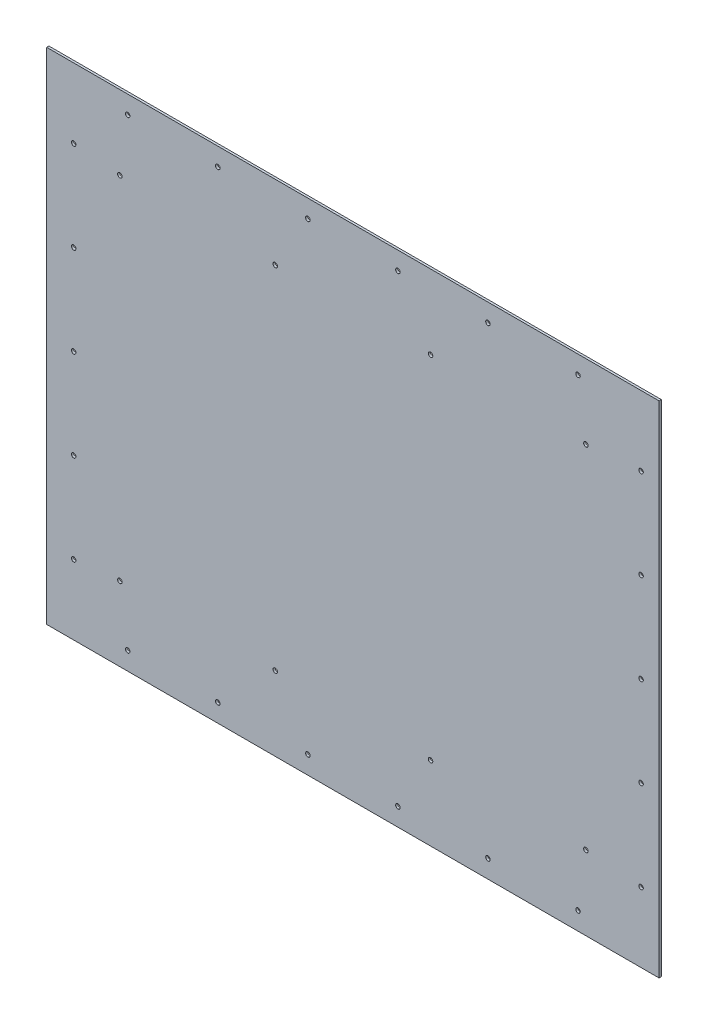
ISO-10303-21;
HEADER;
FILE_DESCRIPTION(('STEP AP214'),'2;1');
FILE_NAME('part.step','',(''),(''),'','','');
FILE_SCHEMA(('AUTOMOTIVE_DESIGN { 1 0 10303 214 1 1 1 1 }'));
ENDSEC;
DATA;
#1=APPLICATION_CONTEXT('core data for automotive mechanical design processes');
#2=APPLICATION_PROTOCOL_DEFINITION('international standard','automotive_design',2000,#1);
#3=PRODUCT_CONTEXT('',#1,'mechanical');
#4=PRODUCT('Part','Part','',(#3));
#5=PRODUCT_RELATED_PRODUCT_CATEGORY('part','',(#4));
#6=PRODUCT_DEFINITION_FORMATION('','',#4);
#7=PRODUCT_DEFINITION_CONTEXT('part definition',#1,'design');
#8=PRODUCT_DEFINITION('design','',#6,#7);
#9=PRODUCT_DEFINITION_SHAPE('','',#8);
#10=(LENGTH_UNIT() NAMED_UNIT(*) SI_UNIT(.MILLI.,.METRE.));
#11=(NAMED_UNIT(*) PLANE_ANGLE_UNIT() SI_UNIT($,.RADIAN.));
#12=(NAMED_UNIT(*) SI_UNIT($,.STERADIAN.) SOLID_ANGLE_UNIT());
#13=UNCERTAINTY_MEASURE_WITH_UNIT(LENGTH_MEASURE(1.E-05),#10,'distance_accuracy_value','');
#14=(GEOMETRIC_REPRESENTATION_CONTEXT(3) GLOBAL_UNCERTAINTY_ASSIGNED_CONTEXT((#13)) GLOBAL_UNIT_ASSIGNED_CONTEXT((#10,
#11,#12)) REPRESENTATION_CONTEXT('',''));
#15=CARTESIAN_POINT('',(0.,0.,0.));
#16=DIRECTION('',(0.,0.,1.));
#17=DIRECTION('',(1.,0.,0.));
#18=AXIS2_PLACEMENT_3D('',#15,#16,#17);
#19=CARTESIAN_POINT('',(760.4125,600.075,3.175));
#20=DIRECTION('',(0.,0.,1.));
#21=DIRECTION('',(1.,0.,0.));
#22=AXIS2_PLACEMENT_3D('',#19,#20,#21);
#23=CYLINDRICAL_SURFACE('',#22,3.17499999999999);
#24=CARTESIAN_POINT('',(760.4125,600.075,0.));
#25=DIRECTION('',(0.,0.,1.));
#26=DIRECTION('',(1.,0.,0.));
#27=AXIS2_PLACEMENT_3D('',#24,#25,#26);
#28=CIRCLE('',#27,3.175);
#29=CARTESIAN_POINT('',(763.5875,600.075,0.));
#30=VERTEX_POINT('',#29);
#31=EDGE_CURVE('E60',#30,#30,#28,.T.);
#32=ORIENTED_EDGE('',*,*,#31,.F.);
#33=EDGE_LOOP('',(#32));
#34=FACE_BOUND('',#33,.T.);
#35=CARTESIAN_POINT('',(760.4125,600.075,3.175));
#36=DIRECTION('',(0.,0.,1.));
#37=DIRECTION('',(1.,0.,0.));
#38=AXIS2_PLACEMENT_3D('',#35,#36,#37);
#39=CIRCLE('',#38,3.17499999999998);
#40=CARTESIAN_POINT('',(763.5875,600.075,3.175));
#41=VERTEX_POINT('',#40);
#42=EDGE_CURVE('E11',#41,#41,#39,.T.);
#43=ORIENTED_EDGE('',*,*,#42,.T.);
#44=EDGE_LOOP('',(#43));
#45=FACE_BOUND('',#44,.T.);
#46=ADVANCED_FACE('F51',(#34,#45),#23,.F.);
#47=CARTESIAN_POINT('',(541.3375,600.075,3.175));
#48=DIRECTION('',(0.,0.,1.));
#49=DIRECTION('',(1.,0.,0.));
#50=AXIS2_PLACEMENT_3D('',#47,#48,#49);
#51=CYLINDRICAL_SURFACE('',#50,3.17499999999999);
#52=CARTESIAN_POINT('',(541.3375,600.075,0.));
#53=DIRECTION('',(0.,0.,1.));
#54=DIRECTION('',(1.,0.,0.));
#55=AXIS2_PLACEMENT_3D('',#52,#53,#54);
#56=CIRCLE('',#55,3.175);
#57=CARTESIAN_POINT('',(544.5125,600.075,0.));
#58=VERTEX_POINT('',#57);
#59=EDGE_CURVE('E302',#58,#58,#56,.T.);
#60=ORIENTED_EDGE('',*,*,#59,.F.);
#61=EDGE_LOOP('',(#60));
#62=FACE_BOUND('',#61,.T.);
#63=CARTESIAN_POINT('',(541.3375,600.075,3.175));
#64=DIRECTION('',(0.,0.,1.));
#65=DIRECTION('',(1.,0.,0.));
#66=AXIS2_PLACEMENT_3D('',#63,#64,#65);
#67=CIRCLE('',#66,3.17499999999998);
#68=CARTESIAN_POINT('',(544.5125,600.075,3.175));
#69=VERTEX_POINT('',#68);
#70=EDGE_CURVE('E306',#69,#69,#67,.T.);
#71=ORIENTED_EDGE('',*,*,#70,.T.);
#72=EDGE_LOOP('',(#71));
#73=FACE_BOUND('',#72,.T.);
#74=ADVANCED_FACE('F318',(#62,#73),#51,.F.);
#75=CARTESIAN_POINT('',(322.2625,600.075,3.175));
#76=DIRECTION('',(0.,0.,1.));
#77=DIRECTION('',(1.,0.,0.));
#78=AXIS2_PLACEMENT_3D('',#75,#76,#77);
#79=CYLINDRICAL_SURFACE('',#78,3.17499999999999);
#80=CARTESIAN_POINT('',(322.2625,600.075,0.));
#81=DIRECTION('',(0.,0.,1.));
#82=DIRECTION('',(1.,0.,0.));
#83=AXIS2_PLACEMENT_3D('',#80,#81,#82);
#84=CIRCLE('',#83,3.175);
#85=CARTESIAN_POINT('',(325.4375,600.075,0.));
#86=VERTEX_POINT('',#85);
#87=EDGE_CURVE('E294',#86,#86,#84,.T.);
#88=ORIENTED_EDGE('',*,*,#87,.F.);
#89=EDGE_LOOP('',(#88));
#90=FACE_BOUND('',#89,.T.);
#91=CARTESIAN_POINT('',(322.2625,600.075,3.175));
#92=DIRECTION('',(0.,0.,1.));
#93=DIRECTION('',(1.,0.,0.));
#94=AXIS2_PLACEMENT_3D('',#91,#92,#93);
#95=CIRCLE('',#94,3.17499999999998);
#96=CARTESIAN_POINT('',(325.4375,600.075,3.175));
#97=VERTEX_POINT('',#96);
#98=EDGE_CURVE('E298',#97,#97,#95,.T.);
#99=ORIENTED_EDGE('',*,*,#98,.T.);
#100=EDGE_LOOP('',(#99));
#101=FACE_BOUND('',#100,.T.);
#102=ADVANCED_FACE('F421',(#90,#101),#79,.F.);
#103=CARTESIAN_POINT('',(103.1875,600.075,3.175));
#104=DIRECTION('',(0.,0.,1.));
#105=DIRECTION('',(1.,0.,0.));
#106=AXIS2_PLACEMENT_3D('',#103,#104,#105);
#107=CYLINDRICAL_SURFACE('',#106,3.17499999999999);
#108=CARTESIAN_POINT('',(103.1875,600.075,0.));
#109=DIRECTION('',(0.,0.,1.));
#110=DIRECTION('',(1.,0.,0.));
#111=AXIS2_PLACEMENT_3D('',#108,#109,#110);
#112=CIRCLE('',#111,3.175);
#113=CARTESIAN_POINT('',(106.3625,600.075,0.));
#114=VERTEX_POINT('',#113);
#115=EDGE_CURVE('E286',#114,#114,#112,.T.);
#116=ORIENTED_EDGE('',*,*,#115,.F.);
#117=EDGE_LOOP('',(#116));
#118=FACE_BOUND('',#117,.T.);
#119=CARTESIAN_POINT('',(103.1875,600.075,3.175));
#120=DIRECTION('',(0.,0.,1.));
#121=DIRECTION('',(1.,0.,0.));
#122=AXIS2_PLACEMENT_3D('',#119,#120,#121);
#123=CIRCLE('',#122,3.17499999999998);
#124=CARTESIAN_POINT('',(106.3625,600.075,3.175));
#125=VERTEX_POINT('',#124);
#126=EDGE_CURVE('E290',#125,#125,#123,.T.);
#127=ORIENTED_EDGE('',*,*,#126,.T.);
#128=EDGE_LOOP('',(#127));
#129=FACE_BOUND('',#128,.T.);
#130=ADVANCED_FACE('F417',(#118,#129),#107,.F.);
#131=CARTESIAN_POINT('',(760.4125,104.775,3.175));
#132=DIRECTION('',(0.,0.,1.));
#133=DIRECTION('',(1.,0.,0.));
#134=AXIS2_PLACEMENT_3D('',#131,#132,#133);
#135=CYLINDRICAL_SURFACE('',#134,3.17499999999999);
#136=CARTESIAN_POINT('',(760.4125,104.775,0.));
#137=DIRECTION('',(0.,0.,1.));
#138=DIRECTION('',(1.,0.,0.));
#139=AXIS2_PLACEMENT_3D('',#136,#137,#138);
#140=CIRCLE('',#139,3.175);
#141=CARTESIAN_POINT('',(763.5875,104.775,0.));
#142=VERTEX_POINT('',#141);
#143=EDGE_CURVE('E278',#142,#142,#140,.T.);
#144=ORIENTED_EDGE('',*,*,#143,.F.);
#145=EDGE_LOOP('',(#144));
#146=FACE_BOUND('',#145,.T.);
#147=CARTESIAN_POINT('',(760.4125,104.775,3.175));
#148=DIRECTION('',(0.,0.,1.));
#149=DIRECTION('',(1.,0.,0.));
#150=AXIS2_PLACEMENT_3D('',#147,#148,#149);
#151=CIRCLE('',#150,3.17499999999998);
#152=CARTESIAN_POINT('',(763.5875,104.775,3.175));
#153=VERTEX_POINT('',#152);
#154=EDGE_CURVE('E282',#153,#153,#151,.T.);
#155=ORIENTED_EDGE('',*,*,#154,.T.);
#156=EDGE_LOOP('',(#155));
#157=FACE_BOUND('',#156,.T.);
#158=ADVANCED_FACE('F413',(#146,#157),#135,.F.);
#159=CARTESIAN_POINT('',(541.3375,104.775,3.175));
#160=DIRECTION('',(0.,0.,1.));
#161=DIRECTION('',(1.,0.,0.));
#162=AXIS2_PLACEMENT_3D('',#159,#160,#161);
#163=CYLINDRICAL_SURFACE('',#162,3.17499999999999);
#164=CARTESIAN_POINT('',(541.3375,104.775,0.));
#165=DIRECTION('',(0.,0.,1.));
#166=DIRECTION('',(1.,0.,0.));
#167=AXIS2_PLACEMENT_3D('',#164,#165,#166);
#168=CIRCLE('',#167,3.175);
#169=CARTESIAN_POINT('',(544.5125,104.775,0.));
#170=VERTEX_POINT('',#169);
#171=EDGE_CURVE('E270',#170,#170,#168,.T.);
#172=ORIENTED_EDGE('',*,*,#171,.F.);
#173=EDGE_LOOP('',(#172));
#174=FACE_BOUND('',#173,.T.);
#175=CARTESIAN_POINT('',(541.3375,104.775,3.175));
#176=DIRECTION('',(0.,0.,1.));
#177=DIRECTION('',(1.,0.,0.));
#178=AXIS2_PLACEMENT_3D('',#175,#176,#177);
#179=CIRCLE('',#178,3.17499999999998);
#180=CARTESIAN_POINT('',(544.5125,104.775,3.175));
#181=VERTEX_POINT('',#180);
#182=EDGE_CURVE('E274',#181,#181,#179,.T.);
#183=ORIENTED_EDGE('',*,*,#182,.T.);
#184=EDGE_LOOP('',(#183));
#185=FACE_BOUND('',#184,.T.);
#186=ADVANCED_FACE('F409',(#174,#185),#163,.F.);
#187=CARTESIAN_POINT('',(838.2,606.425,3.175));
#188=DIRECTION('',(0.,0.,1.));
#189=DIRECTION('',(1.,0.,0.));
#190=AXIS2_PLACEMENT_3D('',#187,#188,#189);
#191=CYLINDRICAL_SURFACE('',#190,3.17500000000004);
#192=CARTESIAN_POINT('',(838.2,606.425,3.175));
#193=DIRECTION('',(0.,0.,1.));
#194=DIRECTION('',(1.,0.,0.));
#195=AXIS2_PLACEMENT_3D('',#192,#193,#194);
#196=CIRCLE('',#195,3.17500000000004);
#197=CARTESIAN_POINT('',(841.375,606.425,3.175));
#198=VERTEX_POINT('',#197);
#199=EDGE_CURVE('E262',#198,#198,#196,.T.);
#200=ORIENTED_EDGE('',*,*,#199,.T.);
#201=EDGE_LOOP('',(#200));
#202=FACE_BOUND('',#201,.T.);
#203=CARTESIAN_POINT('',(838.2,606.425,0.));
#204=DIRECTION('',(0.,0.,-1.));
#205=DIRECTION('',(-1.,0.,0.));
#206=AXIS2_PLACEMENT_3D('',#203,#204,#205);
#207=CIRCLE('',#206,3.17500000000004);
#208=CARTESIAN_POINT('',(835.025,606.425,0.));
#209=VERTEX_POINT('',#208);
#210=EDGE_CURVE('E266',#209,#209,#207,.T.);
#211=ORIENTED_EDGE('',*,*,#210,.T.);
#212=EDGE_LOOP('',(#211));
#213=FACE_BOUND('',#212,.T.);
#214=ADVANCED_FACE('F405',(#202,#213),#191,.F.);
#215=CARTESIAN_POINT('',(838.2,479.425,3.175));
#216=DIRECTION('',(0.,0.,1.));
#217=DIRECTION('',(1.,0.,0.));
#218=AXIS2_PLACEMENT_3D('',#215,#216,#217);
#219=CYLINDRICAL_SURFACE('',#218,3.17500000000004);
#220=CARTESIAN_POINT('',(838.2,479.425,3.175));
#221=DIRECTION('',(0.,0.,1.));
#222=DIRECTION('',(1.,0.,0.));
#223=AXIS2_PLACEMENT_3D('',#220,#221,#222);
#224=CIRCLE('',#223,3.17500000000004);
#225=CARTESIAN_POINT('',(841.375,479.425,3.175));
#226=VERTEX_POINT('',#225);
#227=EDGE_CURVE('E254',#226,#226,#224,.T.);
#228=ORIENTED_EDGE('',*,*,#227,.T.);
#229=EDGE_LOOP('',(#228));
#230=FACE_BOUND('',#229,.T.);
#231=CARTESIAN_POINT('',(838.2,479.425,0.));
#232=DIRECTION('',(0.,0.,-1.));
#233=DIRECTION('',(-1.,0.,0.));
#234=AXIS2_PLACEMENT_3D('',#231,#232,#233);
#235=CIRCLE('',#234,3.17500000000004);
#236=CARTESIAN_POINT('',(835.025,479.425,0.));
#237=VERTEX_POINT('',#236);
#238=EDGE_CURVE('E258',#237,#237,#235,.T.);
#239=ORIENTED_EDGE('',*,*,#238,.T.);
#240=EDGE_LOOP('',(#239));
#241=FACE_BOUND('',#240,.T.);
#242=ADVANCED_FACE('F335',(#230,#241),#219,.F.);
#243=CARTESIAN_POINT('',(838.2,352.425,3.175));
#244=DIRECTION('',(0.,0.,1.));
#245=DIRECTION('',(1.,0.,0.));
#246=AXIS2_PLACEMENT_3D('',#243,#244,#245);
#247=CYLINDRICAL_SURFACE('',#246,3.17500000000004);
#248=CARTESIAN_POINT('',(838.2,352.425,3.175));
#249=DIRECTION('',(0.,0.,1.));
#250=DIRECTION('',(1.,0.,0.));
#251=AXIS2_PLACEMENT_3D('',#248,#249,#250);
#252=CIRCLE('',#251,3.17500000000004);
#253=CARTESIAN_POINT('',(841.375,352.425,3.175));
#254=VERTEX_POINT('',#253);
#255=EDGE_CURVE('E246',#254,#254,#252,.T.);
#256=ORIENTED_EDGE('',*,*,#255,.T.);
#257=EDGE_LOOP('',(#256));
#258=FACE_BOUND('',#257,.T.);
#259=CARTESIAN_POINT('',(838.2,352.425,0.));
#260=DIRECTION('',(0.,0.,-1.));
#261=DIRECTION('',(-1.,0.,0.));
#262=AXIS2_PLACEMENT_3D('',#259,#260,#261);
#263=CIRCLE('',#262,3.17500000000004);
#264=CARTESIAN_POINT('',(835.025,352.425,0.));
#265=VERTEX_POINT('',#264);
#266=EDGE_CURVE('E250',#265,#265,#263,.T.);
#267=ORIENTED_EDGE('',*,*,#266,.T.);
#268=EDGE_LOOP('',(#267));
#269=FACE_BOUND('',#268,.T.);
#270=ADVANCED_FACE('F323',(#258,#269),#247,.F.);
#271=CARTESIAN_POINT('',(0.,0.,3.175));
#272=DIRECTION('',(0.,0.,-1.));
#273=DIRECTION('',(-1.,0.,0.));
#274=AXIS2_PLACEMENT_3D('',#271,#272,#273);
#275=PLANE('',#274);
#276=CARTESIAN_POINT('',(322.2625,104.775,3.175));
#277=DIRECTION('',(0.,0.,1.));
#278=DIRECTION('',(1.,0.,0.));
#279=AXIS2_PLACEMENT_3D('',#276,#277,#278);
#280=CIRCLE('',#279,3.17499999999998);
#281=CARTESIAN_POINT('',(325.4375,104.775,3.175));
#282=VERTEX_POINT('',#281);
#283=EDGE_CURVE('E769',#282,#282,#280,.T.);
#284=ORIENTED_EDGE('',*,*,#283,.F.);
#285=EDGE_LOOP('',(#284));
#286=FACE_BOUND('',#285,.T.);
#287=CARTESIAN_POINT('',(103.1875,104.775,3.175));
#288=DIRECTION('',(0.,0.,1.));
#289=DIRECTION('',(1.,0.,0.));
#290=AXIS2_PLACEMENT_3D('',#287,#288,#289);
#291=CIRCLE('',#290,3.17499999999998);
#292=CARTESIAN_POINT('',(106.3625,104.775,3.175));
#293=VERTEX_POINT('',#292);
#294=EDGE_CURVE('E765',#293,#293,#291,.T.);
#295=ORIENTED_EDGE('',*,*,#294,.F.);
#296=EDGE_LOOP('',(#295));
#297=FACE_BOUND('',#296,.T.);
#298=CARTESIAN_POINT('',(838.2,225.425,3.175));
#299=DIRECTION('',(0.,0.,1.));
#300=DIRECTION('',(1.,0.,0.));
#301=AXIS2_PLACEMENT_3D('',#298,#299,#300);
#302=CIRCLE('',#301,3.17500000000004);
#303=CARTESIAN_POINT('',(841.375,225.425,3.175));
#304=VERTEX_POINT('',#303);
#305=EDGE_CURVE('E757',#304,#304,#302,.T.);
#306=ORIENTED_EDGE('',*,*,#305,.F.);
#307=EDGE_LOOP('',(#306));
#308=FACE_BOUND('',#307,.T.);
#309=CARTESIAN_POINT('',(622.3,25.4,3.175));
#310=DIRECTION('',(0.,0.,1.));
#311=DIRECTION('',(1.,0.,0.));
#312=AXIS2_PLACEMENT_3D('',#309,#310,#311);
#313=CIRCLE('',#312,3.17500000000004);
#314=CARTESIAN_POINT('',(625.475,25.4,3.175));
#315=VERTEX_POINT('',#314);
#316=EDGE_CURVE('E737',#315,#315,#313,.T.);
#317=ORIENTED_EDGE('',*,*,#316,.F.);
#318=EDGE_LOOP('',(#317));
#319=FACE_BOUND('',#318,.T.);
#320=CARTESIAN_POINT('',(749.3,25.4,3.175));
#321=DIRECTION('',(0.,0.,1.));
#322=DIRECTION('',(1.,0.,0.));
#323=AXIS2_PLACEMENT_3D('',#320,#321,#322);
#324=CIRCLE('',#323,3.17500000000004);
#325=CARTESIAN_POINT('',(752.475,25.4,3.175));
#326=VERTEX_POINT('',#325);
#327=EDGE_CURVE('E733',#326,#326,#324,.T.);
#328=ORIENTED_EDGE('',*,*,#327,.F.);
#329=EDGE_LOOP('',(#328));
#330=FACE_BOUND('',#329,.T.);
#331=CARTESIAN_POINT('',(38.1,225.425,3.175));
#332=DIRECTION('',(0.,0.,1.));
#333=DIRECTION('',(1.,0.,0.));
#334=AXIS2_PLACEMENT_3D('',#331,#332,#333);
#335=CIRCLE('',#334,3.175);
#336=CARTESIAN_POINT('',(41.275,225.425,3.175));
#337=VERTEX_POINT('',#336);
#338=EDGE_CURVE('E708',#337,#337,#335,.T.);
#339=ORIENTED_EDGE('',*,*,#338,.F.);
#340=EDGE_LOOP('',(#339));
#341=FACE_BOUND('',#340,.T.);
#342=CARTESIAN_POINT('',(38.1,98.425,3.175));
#343=DIRECTION('',(0.,0.,1.));
#344=DIRECTION('',(1.,0.,0.));
#345=AXIS2_PLACEMENT_3D('',#342,#343,#344);
#346=CIRCLE('',#345,3.175);
#347=CARTESIAN_POINT('',(41.275,98.425,3.175));
#348=VERTEX_POINT('',#347);
#349=EDGE_CURVE('E705',#348,#348,#346,.T.);
#350=ORIENTED_EDGE('',*,*,#349,.F.);
#351=EDGE_LOOP('',(#350));
#352=FACE_BOUND('',#351,.T.);
#353=DIRECTION('',(0.,-1.,0.));
#354=VECTOR('',#353,1.);
#355=CARTESIAN_POINT('',(0.,0.,3.175));
#356=LINE('',#355,#354);
#357=CARTESIAN_POINT('',(0.,704.85,3.175));
#358=VERTEX_POINT('',#357);
#359=CARTESIAN_POINT('',(0.,0.,3.175));
#360=VERTEX_POINT('',#359);
#361=EDGE_CURVE('E105',#358,#360,#356,.T.);
#362=ORIENTED_EDGE('',*,*,#361,.T.);
#363=DIRECTION('',(1.,0.,0.));
#364=VECTOR('',#363,1.);
#365=CARTESIAN_POINT('',(0.,0.,3.175));
#366=LINE('',#365,#364);
#367=CARTESIAN_POINT('',(863.6,0.,3.175));
#368=VERTEX_POINT('',#367);
#369=EDGE_CURVE('E99',#360,#368,#366,.T.);
#370=ORIENTED_EDGE('',*,*,#369,.T.);
#371=DIRECTION('',(0.,1.,0.));
#372=VECTOR('',#371,1.);
#373=CARTESIAN_POINT('',(863.6,0.,3.175));
#374=LINE('',#373,#372);
#375=CARTESIAN_POINT('',(863.6,704.85,3.175));
#376=VERTEX_POINT('',#375);
#377=EDGE_CURVE('E103',#368,#376,#374,.T.);
#378=ORIENTED_EDGE('',*,*,#377,.T.);
#379=DIRECTION('',(-1.,0.,0.));
#380=VECTOR('',#379,1.);
#381=CARTESIAN_POINT('',(0.,704.85,3.175));
#382=LINE('',#381,#380);
#383=EDGE_CURVE('E68',#376,#358,#382,.T.);
#384=ORIENTED_EDGE('',*,*,#383,.T.);
#385=EDGE_LOOP('',(#362,#370,#378,#384));
#386=FACE_BOUND('',#385,.T.);
#387=CARTESIAN_POINT('',(38.1,352.425,3.175));
#388=DIRECTION('',(0.,0.,1.));
#389=DIRECTION('',(1.,0.,0.));
#390=AXIS2_PLACEMENT_3D('',#387,#388,#389);
#391=CIRCLE('',#390,3.175);
#392=CARTESIAN_POINT('',(41.275,352.425,3.175));
#393=VERTEX_POINT('',#392);
#394=EDGE_CURVE('E146',#393,#393,#391,.T.);
#395=ORIENTED_EDGE('',*,*,#394,.F.);
#396=EDGE_LOOP('',(#395));
#397=FACE_BOUND('',#396,.T.);
#398=CARTESIAN_POINT('',(38.1,479.425,3.175));
#399=DIRECTION('',(0.,0.,1.));
#400=DIRECTION('',(1.,0.,0.));
#401=AXIS2_PLACEMENT_3D('',#398,#399,#400);
#402=CIRCLE('',#401,3.175);
#403=CARTESIAN_POINT('',(41.275,479.425,3.175));
#404=VERTEX_POINT('',#403);
#405=EDGE_CURVE('E154',#404,#404,#402,.T.);
#406=ORIENTED_EDGE('',*,*,#405,.F.);
#407=EDGE_LOOP('',(#406));
#408=FACE_BOUND('',#407,.T.);
#409=CARTESIAN_POINT('',(38.1,606.425,3.175));
#410=DIRECTION('',(0.,0.,1.));
#411=DIRECTION('',(1.,0.,0.));
#412=AXIS2_PLACEMENT_3D('',#409,#410,#411);
#413=CIRCLE('',#412,3.175);
#414=CARTESIAN_POINT('',(41.275,606.425,3.175));
#415=VERTEX_POINT('',#414);
#416=EDGE_CURVE('E162',#415,#415,#413,.T.);
#417=ORIENTED_EDGE('',*,*,#416,.F.);
#418=EDGE_LOOP('',(#417));
#419=FACE_BOUND('',#418,.T.);
#420=CARTESIAN_POINT('',(495.3,25.4,3.175));
#421=DIRECTION('',(0.,0.,1.));
#422=DIRECTION('',(1.,0.,0.));
#423=AXIS2_PLACEMENT_3D('',#420,#421,#422);
#424=CIRCLE('',#423,3.17500000000004);
#425=CARTESIAN_POINT('',(498.475,25.4,3.175));
#426=VERTEX_POINT('',#425);
#427=EDGE_CURVE('E170',#426,#426,#424,.T.);
#428=ORIENTED_EDGE('',*,*,#427,.F.);
#429=EDGE_LOOP('',(#428));
#430=FACE_BOUND('',#429,.T.);
#431=CARTESIAN_POINT('',(368.3,25.4,3.175));
#432=DIRECTION('',(0.,0.,1.));
#433=DIRECTION('',(1.,0.,0.));
#434=AXIS2_PLACEMENT_3D('',#431,#432,#433);
#435=CIRCLE('',#434,3.17500000000004);
#436=CARTESIAN_POINT('',(371.475,25.4,3.175));
#437=VERTEX_POINT('',#436);
#438=EDGE_CURVE('E178',#437,#437,#435,.T.);
#439=ORIENTED_EDGE('',*,*,#438,.F.);
#440=EDGE_LOOP('',(#439));
#441=FACE_BOUND('',#440,.T.);
#442=CARTESIAN_POINT('',(241.3,25.4,3.175));
#443=DIRECTION('',(0.,0.,1.));
#444=DIRECTION('',(1.,0.,0.));
#445=AXIS2_PLACEMENT_3D('',#442,#443,#444);
#446=CIRCLE('',#445,3.17500000000004);
#447=CARTESIAN_POINT('',(244.475,25.4,3.175));
#448=VERTEX_POINT('',#447);
#449=EDGE_CURVE('E186',#448,#448,#446,.T.);
#450=ORIENTED_EDGE('',*,*,#449,.F.);
#451=EDGE_LOOP('',(#450));
#452=FACE_BOUND('',#451,.T.);
#453=CARTESIAN_POINT('',(114.3,25.4,3.175));
#454=DIRECTION('',(0.,0.,1.));
#455=DIRECTION('',(1.,0.,0.));
#456=AXIS2_PLACEMENT_3D('',#453,#454,#455);
#457=CIRCLE('',#456,3.17500000000004);
#458=CARTESIAN_POINT('',(117.475,25.4,3.175));
#459=VERTEX_POINT('',#458);
#460=EDGE_CURVE('E194',#459,#459,#457,.T.);
#461=ORIENTED_EDGE('',*,*,#460,.F.);
#462=EDGE_LOOP('',(#461));
#463=FACE_BOUND('',#462,.T.);
#464=CARTESIAN_POINT('',(749.3,679.45,3.175));
#465=DIRECTION('',(0.,0.,1.));
#466=DIRECTION('',(1.,0.,0.));
#467=AXIS2_PLACEMENT_3D('',#464,#465,#466);
#468=CIRCLE('',#467,3.17500000000004);
#469=CARTESIAN_POINT('',(752.475,679.45,3.175));
#470=VERTEX_POINT('',#469);
#471=EDGE_CURVE('E202',#470,#470,#468,.T.);
#472=ORIENTED_EDGE('',*,*,#471,.F.);
#473=EDGE_LOOP('',(#472));
#474=FACE_BOUND('',#473,.T.);
#475=CARTESIAN_POINT('',(622.3,679.45,3.175));
#476=DIRECTION('',(0.,0.,1.));
#477=DIRECTION('',(1.,0.,0.));
#478=AXIS2_PLACEMENT_3D('',#475,#476,#477);
#479=CIRCLE('',#478,3.17500000000004);
#480=CARTESIAN_POINT('',(625.475,679.45,3.175));
#481=VERTEX_POINT('',#480);
#482=EDGE_CURVE('E210',#481,#481,#479,.T.);
#483=ORIENTED_EDGE('',*,*,#482,.F.);
#484=EDGE_LOOP('',(#483));
#485=FACE_BOUND('',#484,.T.);
#486=CARTESIAN_POINT('',(495.3,679.45,3.175));
#487=DIRECTION('',(0.,0.,1.));
#488=DIRECTION('',(1.,0.,0.));
#489=AXIS2_PLACEMENT_3D('',#486,#487,#488);
#490=CIRCLE('',#489,3.17500000000004);
#491=CARTESIAN_POINT('',(498.475,679.45,3.175));
#492=VERTEX_POINT('',#491);
#493=EDGE_CURVE('E218',#492,#492,#490,.T.);
#494=ORIENTED_EDGE('',*,*,#493,.F.);
#495=EDGE_LOOP('',(#494));
#496=FACE_BOUND('',#495,.T.);
#497=CARTESIAN_POINT('',(368.3,679.45,3.175));
#498=DIRECTION('',(0.,0.,1.));
#499=DIRECTION('',(1.,0.,0.));
#500=AXIS2_PLACEMENT_3D('',#497,#498,#499);
#501=CIRCLE('',#500,3.17500000000004);
#502=CARTESIAN_POINT('',(371.475,679.45,3.175));
#503=VERTEX_POINT('',#502);
#504=EDGE_CURVE('E226',#503,#503,#501,.T.);
#505=ORIENTED_EDGE('',*,*,#504,.F.);
#506=EDGE_LOOP('',(#505));
#507=FACE_BOUND('',#506,.T.);
#508=CARTESIAN_POINT('',(241.3,679.45,3.175));
#509=DIRECTION('',(0.,0.,1.));
#510=DIRECTION('',(1.,0.,0.));
#511=AXIS2_PLACEMENT_3D('',#508,#509,#510);
#512=CIRCLE('',#511,3.17500000000004);
#513=CARTESIAN_POINT('',(244.475,679.45,3.175));
#514=VERTEX_POINT('',#513);
#515=EDGE_CURVE('E234',#514,#514,#512,.T.);
#516=ORIENTED_EDGE('',*,*,#515,.F.);
#517=EDGE_LOOP('',(#516));
#518=FACE_BOUND('',#517,.T.);
#519=CARTESIAN_POINT('',(114.3,679.45,3.175));
#520=DIRECTION('',(0.,0.,1.));
#521=DIRECTION('',(1.,0.,0.));
#522=AXIS2_PLACEMENT_3D('',#519,#520,#521);
#523=CIRCLE('',#522,3.17500000000004);
#524=CARTESIAN_POINT('',(117.475,679.45,3.175));
#525=VERTEX_POINT('',#524);
#526=EDGE_CURVE('E242',#525,#525,#523,.T.);
#527=ORIENTED_EDGE('',*,*,#526,.F.);
#528=EDGE_LOOP('',(#527));
#529=FACE_BOUND('',#528,.T.);
#530=CARTESIAN_POINT('',(838.2,98.425,3.175));
#531=DIRECTION('',(0.,0.,1.));
#532=DIRECTION('',(1.,0.,0.));
#533=AXIS2_PLACEMENT_3D('',#530,#531,#532);
#534=CIRCLE('',#533,3.17500000000004);
#535=CARTESIAN_POINT('',(841.375,98.425,3.175));
#536=VERTEX_POINT('',#535);
#537=EDGE_CURVE('E749',#536,#536,#534,.T.);
#538=ORIENTED_EDGE('',*,*,#537,.F.);
#539=EDGE_LOOP('',(#538));
#540=FACE_BOUND('',#539,.T.);
#541=ORIENTED_EDGE('',*,*,#255,.F.);
#542=EDGE_LOOP('',(#541));
#543=FACE_BOUND('',#542,.T.);
#544=ORIENTED_EDGE('',*,*,#227,.F.);
#545=EDGE_LOOP('',(#544));
#546=FACE_BOUND('',#545,.T.);
#547=ORIENTED_EDGE('',*,*,#199,.F.);
#548=EDGE_LOOP('',(#547));
#549=FACE_BOUND('',#548,.T.);
#550=ORIENTED_EDGE('',*,*,#182,.F.);
#551=EDGE_LOOP('',(#550));
#552=FACE_BOUND('',#551,.T.);
#553=ORIENTED_EDGE('',*,*,#154,.F.);
#554=EDGE_LOOP('',(#553));
#555=FACE_BOUND('',#554,.T.);
#556=ORIENTED_EDGE('',*,*,#126,.F.);
#557=EDGE_LOOP('',(#556));
#558=FACE_BOUND('',#557,.T.);
#559=ORIENTED_EDGE('',*,*,#98,.F.);
#560=EDGE_LOOP('',(#559));
#561=FACE_BOUND('',#560,.T.);
#562=ORIENTED_EDGE('',*,*,#70,.F.);
#563=EDGE_LOOP('',(#562));
#564=FACE_BOUND('',#563,.T.);
#565=ORIENTED_EDGE('',*,*,#42,.F.);
#566=EDGE_LOOP('',(#565));
#567=FACE_BOUND('',#566,.T.);
#568=ADVANCED_FACE('F100',(#286,#297,#308,#319,#330,#341,#352,#386,#397,#408,#419,#430,#441,
#452,#463,#474,#485,#496,#507,#518,#529,#540,#543,#546,#549,#552,#555,#558,#561,#564,#567),#275,.F.);
#569=CARTESIAN_POINT('',(114.3,679.45,3.175));
#570=DIRECTION('',(0.,0.,1.));
#571=DIRECTION('',(1.,0.,0.));
#572=AXIS2_PLACEMENT_3D('',#569,#570,#571);
#573=CYLINDRICAL_SURFACE('',#572,3.17500000000004);
#574=CARTESIAN_POINT('',(114.3,679.45,0.));
#575=DIRECTION('',(0.,0.,1.));
#576=DIRECTION('',(1.,0.,0.));
#577=AXIS2_PLACEMENT_3D('',#574,#575,#576);
#578=CIRCLE('',#577,3.17500000000004);
#579=CARTESIAN_POINT('',(117.475,679.45,0.));
#580=VERTEX_POINT('',#579);
#581=EDGE_CURVE('E238',#580,#580,#578,.T.);
#582=ORIENTED_EDGE('',*,*,#581,.F.);
#583=EDGE_LOOP('',(#582));
#584=FACE_BOUND('',#583,.T.);
#585=ORIENTED_EDGE('',*,*,#526,.T.);
#586=EDGE_LOOP('',(#585));
#587=FACE_BOUND('',#586,.T.);
#588=ADVANCED_FACE('F322',(#584,#587),#573,.F.);
#589=CARTESIAN_POINT('',(241.3,679.45,3.175));
#590=DIRECTION('',(0.,0.,1.));
#591=DIRECTION('',(1.,0.,0.));
#592=AXIS2_PLACEMENT_3D('',#589,#590,#591);
#593=CYLINDRICAL_SURFACE('',#592,3.17500000000004);
#594=CARTESIAN_POINT('',(241.3,679.45,0.));
#595=DIRECTION('',(0.,0.,1.));
#596=DIRECTION('',(1.,0.,0.));
#597=AXIS2_PLACEMENT_3D('',#594,#595,#596);
#598=CIRCLE('',#597,3.17500000000004);
#599=CARTESIAN_POINT('',(244.475,679.45,0.));
#600=VERTEX_POINT('',#599);
#601=EDGE_CURVE('E230',#600,#600,#598,.T.);
#602=ORIENTED_EDGE('',*,*,#601,.F.);
#603=EDGE_LOOP('',(#602));
#604=FACE_BOUND('',#603,.T.);
#605=ORIENTED_EDGE('',*,*,#515,.T.);
#606=EDGE_LOOP('',(#605));
#607=FACE_BOUND('',#606,.T.);
#608=ADVANCED_FACE('F331',(#604,#607),#593,.F.);
#609=CARTESIAN_POINT('',(368.3,679.45,3.175));
#610=DIRECTION('',(0.,0.,1.));
#611=DIRECTION('',(1.,0.,0.));
#612=AXIS2_PLACEMENT_3D('',#609,#610,#611);
#613=CYLINDRICAL_SURFACE('',#612,3.17500000000004);
#614=CARTESIAN_POINT('',(368.3,679.45,0.));
#615=DIRECTION('',(0.,0.,1.));
#616=DIRECTION('',(1.,0.,0.));
#617=AXIS2_PLACEMENT_3D('',#614,#615,#616);
#618=CIRCLE('',#617,3.17500000000004);
#619=CARTESIAN_POINT('',(371.475,679.45,0.));
#620=VERTEX_POINT('',#619);
#621=EDGE_CURVE('E222',#620,#620,#618,.T.);
#622=ORIENTED_EDGE('',*,*,#621,.F.);
#623=EDGE_LOOP('',(#622));
#624=FACE_BOUND('',#623,.T.);
#625=ORIENTED_EDGE('',*,*,#504,.T.);
#626=EDGE_LOOP('',(#625));
#627=FACE_BOUND('',#626,.T.);
#628=ADVANCED_FACE('F395',(#624,#627),#613,.F.);
#629=CARTESIAN_POINT('',(495.3,679.45,3.175));
#630=DIRECTION('',(0.,0.,1.));
#631=DIRECTION('',(1.,0.,0.));
#632=AXIS2_PLACEMENT_3D('',#629,#630,#631);
#633=CYLINDRICAL_SURFACE('',#632,3.17500000000004);
#634=CARTESIAN_POINT('',(495.3,679.45,0.));
#635=DIRECTION('',(0.,0.,1.));
#636=DIRECTION('',(1.,0.,0.));
#637=AXIS2_PLACEMENT_3D('',#634,#635,#636);
#638=CIRCLE('',#637,3.17500000000004);
#639=CARTESIAN_POINT('',(498.475,679.45,0.));
#640=VERTEX_POINT('',#639);
#641=EDGE_CURVE('E214',#640,#640,#638,.T.);
#642=ORIENTED_EDGE('',*,*,#641,.F.);
#643=EDGE_LOOP('',(#642));
#644=FACE_BOUND('',#643,.T.);
#645=ORIENTED_EDGE('',*,*,#493,.T.);
#646=EDGE_LOOP('',(#645));
#647=FACE_BOUND('',#646,.T.);
#648=ADVANCED_FACE('F391',(#644,#647),#633,.F.);
#649=CARTESIAN_POINT('',(622.3,679.45,3.175));
#650=DIRECTION('',(0.,0.,1.));
#651=DIRECTION('',(1.,0.,0.));
#652=AXIS2_PLACEMENT_3D('',#649,#650,#651);
#653=CYLINDRICAL_SURFACE('',#652,3.17500000000004);
#654=CARTESIAN_POINT('',(622.3,679.45,0.));
#655=DIRECTION('',(0.,0.,1.));
#656=DIRECTION('',(1.,0.,0.));
#657=AXIS2_PLACEMENT_3D('',#654,#655,#656);
#658=CIRCLE('',#657,3.17500000000004);
#659=CARTESIAN_POINT('',(625.475,679.45,0.));
#660=VERTEX_POINT('',#659);
#661=EDGE_CURVE('E206',#660,#660,#658,.T.);
#662=ORIENTED_EDGE('',*,*,#661,.F.);
#663=EDGE_LOOP('',(#662));
#664=FACE_BOUND('',#663,.T.);
#665=ORIENTED_EDGE('',*,*,#482,.T.);
#666=EDGE_LOOP('',(#665));
#667=FACE_BOUND('',#666,.T.);
#668=ADVANCED_FACE('F387',(#664,#667),#653,.F.);
#669=CARTESIAN_POINT('',(749.3,679.45,3.175));
#670=DIRECTION('',(0.,0.,1.));
#671=DIRECTION('',(1.,0.,0.));
#672=AXIS2_PLACEMENT_3D('',#669,#670,#671);
#673=CYLINDRICAL_SURFACE('',#672,3.17500000000004);
#674=CARTESIAN_POINT('',(749.3,679.45,0.));
#675=DIRECTION('',(0.,0.,1.));
#676=DIRECTION('',(1.,0.,0.));
#677=AXIS2_PLACEMENT_3D('',#674,#675,#676);
#678=CIRCLE('',#677,3.17500000000004);
#679=CARTESIAN_POINT('',(752.475,679.45,0.));
#680=VERTEX_POINT('',#679);
#681=EDGE_CURVE('E198',#680,#680,#678,.T.);
#682=ORIENTED_EDGE('',*,*,#681,.F.);
#683=EDGE_LOOP('',(#682));
#684=FACE_BOUND('',#683,.T.);
#685=ORIENTED_EDGE('',*,*,#471,.T.);
#686=EDGE_LOOP('',(#685));
#687=FACE_BOUND('',#686,.T.);
#688=ADVANCED_FACE('F383',(#684,#687),#673,.F.);
#689=CARTESIAN_POINT('',(114.3,25.4,3.175));
#690=DIRECTION('',(0.,0.,1.));
#691=DIRECTION('',(1.,0.,0.));
#692=AXIS2_PLACEMENT_3D('',#689,#690,#691);
#693=CYLINDRICAL_SURFACE('',#692,3.17500000000004);
#694=CARTESIAN_POINT('',(114.3,25.4,0.));
#695=DIRECTION('',(0.,0.,1.));
#696=DIRECTION('',(1.,0.,0.));
#697=AXIS2_PLACEMENT_3D('',#694,#695,#696);
#698=CIRCLE('',#697,3.17500000000004);
#699=CARTESIAN_POINT('',(117.475,25.4,0.));
#700=VERTEX_POINT('',#699);
#701=EDGE_CURVE('E190',#700,#700,#698,.T.);
#702=ORIENTED_EDGE('',*,*,#701,.F.);
#703=EDGE_LOOP('',(#702));
#704=FACE_BOUND('',#703,.T.);
#705=ORIENTED_EDGE('',*,*,#460,.T.);
#706=EDGE_LOOP('',(#705));
#707=FACE_BOUND('',#706,.T.);
#708=ADVANCED_FACE('F379',(#704,#707),#693,.F.);
#709=CARTESIAN_POINT('',(241.3,25.4,3.175));
#710=DIRECTION('',(0.,0.,1.));
#711=DIRECTION('',(1.,0.,0.));
#712=AXIS2_PLACEMENT_3D('',#709,#710,#711);
#713=CYLINDRICAL_SURFACE('',#712,3.17500000000004);
#714=CARTESIAN_POINT('',(241.3,25.4,0.));
#715=DIRECTION('',(0.,0.,1.));
#716=DIRECTION('',(1.,0.,0.));
#717=AXIS2_PLACEMENT_3D('',#714,#715,#716);
#718=CIRCLE('',#717,3.17500000000004);
#719=CARTESIAN_POINT('',(244.475,25.4,0.));
#720=VERTEX_POINT('',#719);
#721=EDGE_CURVE('E182',#720,#720,#718,.T.);
#722=ORIENTED_EDGE('',*,*,#721,.F.);
#723=EDGE_LOOP('',(#722));
#724=FACE_BOUND('',#723,.T.);
#725=ORIENTED_EDGE('',*,*,#449,.T.);
#726=EDGE_LOOP('',(#725));
#727=FACE_BOUND('',#726,.T.);
#728=ADVANCED_FACE('F375',(#724,#727),#713,.F.);
#729=CARTESIAN_POINT('',(368.3,25.4,3.175));
#730=DIRECTION('',(0.,0.,1.));
#731=DIRECTION('',(1.,0.,0.));
#732=AXIS2_PLACEMENT_3D('',#729,#730,#731);
#733=CYLINDRICAL_SURFACE('',#732,3.17500000000004);
#734=CARTESIAN_POINT('',(368.3,25.4,0.));
#735=DIRECTION('',(0.,0.,1.));
#736=DIRECTION('',(1.,0.,0.));
#737=AXIS2_PLACEMENT_3D('',#734,#735,#736);
#738=CIRCLE('',#737,3.17500000000004);
#739=CARTESIAN_POINT('',(371.475,25.4,0.));
#740=VERTEX_POINT('',#739);
#741=EDGE_CURVE('E174',#740,#740,#738,.T.);
#742=ORIENTED_EDGE('',*,*,#741,.F.);
#743=EDGE_LOOP('',(#742));
#744=FACE_BOUND('',#743,.T.);
#745=ORIENTED_EDGE('',*,*,#438,.T.);
#746=EDGE_LOOP('',(#745));
#747=FACE_BOUND('',#746,.T.);
#748=ADVANCED_FACE('F371',(#744,#747),#733,.F.);
#749=CARTESIAN_POINT('',(495.3,25.4,3.175));
#750=DIRECTION('',(0.,0.,1.));
#751=DIRECTION('',(1.,0.,0.));
#752=AXIS2_PLACEMENT_3D('',#749,#750,#751);
#753=CYLINDRICAL_SURFACE('',#752,3.17500000000004);
#754=CARTESIAN_POINT('',(495.3,25.4,0.));
#755=DIRECTION('',(0.,0.,1.));
#756=DIRECTION('',(1.,0.,0.));
#757=AXIS2_PLACEMENT_3D('',#754,#755,#756);
#758=CIRCLE('',#757,3.17500000000004);
#759=CARTESIAN_POINT('',(498.475,25.4,0.));
#760=VERTEX_POINT('',#759);
#761=EDGE_CURVE('E166',#760,#760,#758,.T.);
#762=ORIENTED_EDGE('',*,*,#761,.F.);
#763=EDGE_LOOP('',(#762));
#764=FACE_BOUND('',#763,.T.);
#765=ORIENTED_EDGE('',*,*,#427,.T.);
#766=EDGE_LOOP('',(#765));
#767=FACE_BOUND('',#766,.T.);
#768=ADVANCED_FACE('F367',(#764,#767),#753,.F.);
#769=CARTESIAN_POINT('',(38.1,606.425,3.175));
#770=DIRECTION('',(0.,0.,1.));
#771=DIRECTION('',(1.,0.,0.));
#772=AXIS2_PLACEMENT_3D('',#769,#770,#771);
#773=CYLINDRICAL_SURFACE('',#772,3.175);
#774=CARTESIAN_POINT('',(38.1,606.425,0.));
#775=DIRECTION('',(0.,0.,1.));
#776=DIRECTION('',(1.,0.,0.));
#777=AXIS2_PLACEMENT_3D('',#774,#775,#776);
#778=CIRCLE('',#777,3.175);
#779=CARTESIAN_POINT('',(41.275,606.425,0.));
#780=VERTEX_POINT('',#779);
#781=EDGE_CURVE('E158',#780,#780,#778,.T.);
#782=ORIENTED_EDGE('',*,*,#781,.F.);
#783=EDGE_LOOP('',(#782));
#784=FACE_BOUND('',#783,.T.);
#785=ORIENTED_EDGE('',*,*,#416,.T.);
#786=EDGE_LOOP('',(#785));
#787=FACE_BOUND('',#786,.T.);
#788=ADVANCED_FACE('F363',(#784,#787),#773,.F.);
#789=CARTESIAN_POINT('',(38.1,479.425,3.175));
#790=DIRECTION('',(0.,0.,1.));
#791=DIRECTION('',(1.,0.,0.));
#792=AXIS2_PLACEMENT_3D('',#789,#790,#791);
#793=CYLINDRICAL_SURFACE('',#792,3.175);
#794=CARTESIAN_POINT('',(38.1,479.425,0.));
#795=DIRECTION('',(0.,0.,1.));
#796=DIRECTION('',(1.,0.,0.));
#797=AXIS2_PLACEMENT_3D('',#794,#795,#796);
#798=CIRCLE('',#797,3.175);
#799=CARTESIAN_POINT('',(41.275,479.425,0.));
#800=VERTEX_POINT('',#799);
#801=EDGE_CURVE('E150',#800,#800,#798,.T.);
#802=ORIENTED_EDGE('',*,*,#801,.F.);
#803=EDGE_LOOP('',(#802));
#804=FACE_BOUND('',#803,.T.);
#805=ORIENTED_EDGE('',*,*,#405,.T.);
#806=EDGE_LOOP('',(#805));
#807=FACE_BOUND('',#806,.T.);
#808=ADVANCED_FACE('F359',(#804,#807),#793,.F.);
#809=CARTESIAN_POINT('',(38.1,352.425,3.175));
#810=DIRECTION('',(0.,0.,1.));
#811=DIRECTION('',(1.,0.,0.));
#812=AXIS2_PLACEMENT_3D('',#809,#810,#811);
#813=CYLINDRICAL_SURFACE('',#812,3.175);
#814=CARTESIAN_POINT('',(38.1,352.425,0.));
#815=DIRECTION('',(0.,0.,1.));
#816=DIRECTION('',(1.,0.,0.));
#817=AXIS2_PLACEMENT_3D('',#814,#815,#816);
#818=CIRCLE('',#817,3.175);
#819=CARTESIAN_POINT('',(41.275,352.425,0.));
#820=VERTEX_POINT('',#819);
#821=EDGE_CURVE('E142',#820,#820,#818,.T.);
#822=ORIENTED_EDGE('',*,*,#821,.F.);
#823=EDGE_LOOP('',(#822));
#824=FACE_BOUND('',#823,.T.);
#825=ORIENTED_EDGE('',*,*,#394,.T.);
#826=EDGE_LOOP('',(#825));
#827=FACE_BOUND('',#826,.T.);
#828=ADVANCED_FACE('F355',(#824,#827),#813,.F.);
#829=CARTESIAN_POINT('',(0.,0.,3.175));
#830=DIRECTION('',(1.,0.,0.));
#831=DIRECTION('',(0.,0.,-1.));
#832=AXIS2_PLACEMENT_3D('',#829,#830,#831);
#833=PLANE('',#832);
#834=DIRECTION('',(0.,-1.,0.));
#835=VECTOR('',#834,1.);
#836=CARTESIAN_POINT('',(0.,0.,0.));
#837=LINE('',#836,#835);
#838=CARTESIAN_POINT('',(0.,704.85,0.));
#839=VERTEX_POINT('',#838);
#840=CARTESIAN_POINT('',(0.,0.,0.));
#841=VERTEX_POINT('',#840);
#842=EDGE_CURVE('E125',#839,#841,#837,.T.);
#843=ORIENTED_EDGE('',*,*,#842,.T.);
#844=DIRECTION('',(0.,0.,-1.));
#845=VECTOR('',#844,1.);
#846=CARTESIAN_POINT('',(0.,0.,3.175));
#847=LINE('',#846,#845);
#848=EDGE_CURVE('E113',#360,#841,#847,.T.);
#849=ORIENTED_EDGE('',*,*,#848,.F.);
#850=ORIENTED_EDGE('',*,*,#361,.F.);
#851=DIRECTION('',(0.,0.,-1.));
#852=VECTOR('',#851,1.);
#853=CARTESIAN_POINT('',(0.,704.85,3.175));
#854=LINE('',#853,#852);
#855=EDGE_CURVE('E121',#358,#839,#854,.T.);
#856=ORIENTED_EDGE('',*,*,#855,.T.);
#857=EDGE_LOOP('',(#843,#849,#850,#856));
#858=FACE_BOUND('',#857,.T.);
#859=ADVANCED_FACE('F352',(#858),#833,.F.);
#860=CARTESIAN_POINT('',(0.,0.,3.175));
#861=DIRECTION('',(0.,1.,0.));
#862=DIRECTION('',(0.,0.,1.));
#863=AXIS2_PLACEMENT_3D('',#860,#861,#862);
#864=PLANE('',#863);
#865=DIRECTION('',(1.,0.,0.));
#866=VECTOR('',#865,1.);
#867=CARTESIAN_POINT('',(0.,0.,0.));
#868=LINE('',#867,#866);
#869=CARTESIAN_POINT('',(863.6,0.,0.));
#870=VERTEX_POINT('',#869);
#871=EDGE_CURVE('E111',#841,#870,#868,.T.);
#872=ORIENTED_EDGE('',*,*,#871,.T.);
#873=DIRECTION('',(0.,0.,-1.));
#874=VECTOR('',#873,1.);
#875=CARTESIAN_POINT('',(863.6,0.,3.175));
#876=LINE('',#875,#874);
#877=EDGE_CURVE('E109',#368,#870,#876,.T.);
#878=ORIENTED_EDGE('',*,*,#877,.F.);
#879=ORIENTED_EDGE('',*,*,#369,.F.);
#880=ORIENTED_EDGE('',*,*,#848,.T.);
#881=EDGE_LOOP('',(#872,#878,#879,#880));
#882=FACE_BOUND('',#881,.T.);
#883=ADVANCED_FACE('F110',(#882),#864,.F.);
#884=CARTESIAN_POINT('',(863.6,0.,3.175));
#885=DIRECTION('',(-1.,0.,0.));
#886=DIRECTION('',(0.,0.,1.));
#887=AXIS2_PLACEMENT_3D('',#884,#885,#886);
#888=PLANE('',#887);
#889=DIRECTION('',(0.,1.,0.));
#890=VECTOR('',#889,1.);
#891=CARTESIAN_POINT('',(863.6,0.,0.));
#892=LINE('',#891,#890);
#893=CARTESIAN_POINT('',(863.6,704.85,0.));
#894=VERTEX_POINT('',#893);
#895=EDGE_CURVE('E85',#870,#894,#892,.T.);
#896=ORIENTED_EDGE('',*,*,#895,.T.);
#897=DIRECTION('',(0.,0.,-1.));
#898=VECTOR('',#897,1.);
#899=CARTESIAN_POINT('',(863.6,704.85,3.175));
#900=LINE('',#899,#898);
#901=EDGE_CURVE('E114',#376,#894,#900,.T.);
#902=ORIENTED_EDGE('',*,*,#901,.F.);
#903=ORIENTED_EDGE('',*,*,#377,.F.);
#904=ORIENTED_EDGE('',*,*,#877,.T.);
#905=EDGE_LOOP('',(#896,#902,#903,#904));
#906=FACE_BOUND('',#905,.T.);
#907=ADVANCED_FACE('F116',(#906),#888,.F.);
#908=CARTESIAN_POINT('',(0.,704.85,3.175));
#909=DIRECTION('',(0.,-1.,0.));
#910=DIRECTION('',(0.,0.,-1.));
#911=AXIS2_PLACEMENT_3D('',#908,#909,#910);
#912=PLANE('',#911);
#913=DIRECTION('',(-1.,0.,0.));
#914=VECTOR('',#913,1.);
#915=CARTESIAN_POINT('',(0.,704.85,0.));
#916=LINE('',#915,#914);
#917=EDGE_CURVE('E91',#894,#839,#916,.T.);
#918=ORIENTED_EDGE('',*,*,#917,.T.);
#919=ORIENTED_EDGE('',*,*,#855,.F.);
#920=ORIENTED_EDGE('',*,*,#383,.F.);
#921=ORIENTED_EDGE('',*,*,#901,.T.);
#922=EDGE_LOOP('',(#918,#919,#920,#921));
#923=FACE_BOUND('',#922,.T.);
#924=ADVANCED_FACE('F345',(#923),#912,.F.);
#925=CARTESIAN_POINT('',(0.,0.,0.));
#926=DIRECTION('',(0.,0.,-1.));
#927=DIRECTION('',(-1.,0.,0.));
#928=AXIS2_PLACEMENT_3D('',#925,#926,#927);
#929=PLANE('',#928);
#930=CARTESIAN_POINT('',(322.2625,104.775,0.));
#931=DIRECTION('',(0.,0.,1.));
#932=DIRECTION('',(1.,0.,0.));
#933=AXIS2_PLACEMENT_3D('',#930,#931,#932);
#934=CIRCLE('',#933,3.175);
#935=CARTESIAN_POINT('',(325.4375,104.775,0.));
#936=VERTEX_POINT('',#935);
#937=EDGE_CURVE('E773',#936,#936,#934,.T.);
#938=ORIENTED_EDGE('',*,*,#937,.T.);
#939=EDGE_LOOP('',(#938));
#940=FACE_BOUND('',#939,.T.);
#941=CARTESIAN_POINT('',(103.1875,104.775,0.));
#942=DIRECTION('',(0.,0.,1.));
#943=DIRECTION('',(1.,0.,0.));
#944=AXIS2_PLACEMENT_3D('',#941,#942,#943);
#945=CIRCLE('',#944,3.175);
#946=CARTESIAN_POINT('',(106.3625,104.775,0.));
#947=VERTEX_POINT('',#946);
#948=EDGE_CURVE('E761',#947,#947,#945,.T.);
#949=ORIENTED_EDGE('',*,*,#948,.T.);
#950=EDGE_LOOP('',(#949));
#951=FACE_BOUND('',#950,.T.);
#952=CARTESIAN_POINT('',(838.2,225.425,0.));
#953=DIRECTION('',(0.,0.,-1.));
#954=DIRECTION('',(-1.,0.,0.));
#955=AXIS2_PLACEMENT_3D('',#952,#953,#954);
#956=CIRCLE('',#955,3.17500000000004);
#957=CARTESIAN_POINT('',(835.025,225.425,0.));
#958=VERTEX_POINT('',#957);
#959=EDGE_CURVE('E753',#958,#958,#956,.T.);
#960=ORIENTED_EDGE('',*,*,#959,.F.);
#961=EDGE_LOOP('',(#960));
#962=FACE_BOUND('',#961,.T.);
#963=CARTESIAN_POINT('',(838.2,98.425,0.));
#964=DIRECTION('',(0.,0.,-1.));
#965=DIRECTION('',(-1.,0.,0.));
#966=AXIS2_PLACEMENT_3D('',#963,#964,#965);
#967=CIRCLE('',#966,3.17500000000004);
#968=CARTESIAN_POINT('',(835.025,98.425,0.));
#969=VERTEX_POINT('',#968);
#970=EDGE_CURVE('E745',#969,#969,#967,.T.);
#971=ORIENTED_EDGE('',*,*,#970,.F.);
#972=EDGE_LOOP('',(#971));
#973=FACE_BOUND('',#972,.T.);
#974=CARTESIAN_POINT('',(622.3,25.4,0.));
#975=DIRECTION('',(0.,0.,1.));
#976=DIRECTION('',(1.,0.,0.));
#977=AXIS2_PLACEMENT_3D('',#974,#975,#976);
#978=CIRCLE('',#977,3.17500000000004);
#979=CARTESIAN_POINT('',(625.475,25.4,0.));
#980=VERTEX_POINT('',#979);
#981=EDGE_CURVE('E741',#980,#980,#978,.T.);
#982=ORIENTED_EDGE('',*,*,#981,.T.);
#983=EDGE_LOOP('',(#982));
#984=FACE_BOUND('',#983,.T.);
#985=CARTESIAN_POINT('',(749.3,25.4,0.));
#986=DIRECTION('',(0.,0.,1.));
#987=DIRECTION('',(1.,0.,0.));
#988=AXIS2_PLACEMENT_3D('',#985,#986,#987);
#989=CIRCLE('',#988,3.17500000000004);
#990=CARTESIAN_POINT('',(752.475,25.4,0.));
#991=VERTEX_POINT('',#990);
#992=EDGE_CURVE('E729',#991,#991,#989,.T.);
#993=ORIENTED_EDGE('',*,*,#992,.T.);
#994=EDGE_LOOP('',(#993));
#995=FACE_BOUND('',#994,.T.);
#996=CARTESIAN_POINT('',(38.1,225.425,0.));
#997=DIRECTION('',(0.,0.,1.));
#998=DIRECTION('',(1.,0.,0.));
#999=AXIS2_PLACEMENT_3D('',#996,#997,#998);
#1000=CIRCLE('',#999,3.175);
#1001=CARTESIAN_POINT('',(41.275,225.425,0.));
#1002=VERTEX_POINT('',#1001);
#1003=EDGE_CURVE('E715',#1002,#1002,#1000,.T.);
#1004=ORIENTED_EDGE('',*,*,#1003,.T.);
#1005=EDGE_LOOP('',(#1004));
#1006=FACE_BOUND('',#1005,.T.);
#1007=CARTESIAN_POINT('',(38.1,98.425,0.));
#1008=DIRECTION('',(0.,0.,1.));
#1009=DIRECTION('',(1.,0.,0.));
#1010=AXIS2_PLACEMENT_3D('',#1007,#1008,#1009);
#1011=CIRCLE('',#1010,3.175);
#1012=CARTESIAN_POINT('',(41.275,98.425,0.));
#1013=VERTEX_POINT('',#1012);
#1014=EDGE_CURVE('E129',#1013,#1013,#1011,.T.);
#1015=ORIENTED_EDGE('',*,*,#1014,.T.);
#1016=EDGE_LOOP('',(#1015));
#1017=FACE_BOUND('',#1016,.T.);
#1018=ORIENTED_EDGE('',*,*,#842,.F.);
#1019=ORIENTED_EDGE('',*,*,#917,.F.);
#1020=ORIENTED_EDGE('',*,*,#895,.F.);
#1021=ORIENTED_EDGE('',*,*,#871,.F.);
#1022=EDGE_LOOP('',(#1018,#1019,#1020,#1021));
#1023=FACE_BOUND('',#1022,.T.);
#1024=ORIENTED_EDGE('',*,*,#821,.T.);
#1025=EDGE_LOOP('',(#1024));
#1026=FACE_BOUND('',#1025,.T.);
#1027=ORIENTED_EDGE('',*,*,#801,.T.);
#1028=EDGE_LOOP('',(#1027));
#1029=FACE_BOUND('',#1028,.T.);
#1030=ORIENTED_EDGE('',*,*,#781,.T.);
#1031=EDGE_LOOP('',(#1030));
#1032=FACE_BOUND('',#1031,.T.);
#1033=ORIENTED_EDGE('',*,*,#761,.T.);
#1034=EDGE_LOOP('',(#1033));
#1035=FACE_BOUND('',#1034,.T.);
#1036=ORIENTED_EDGE('',*,*,#741,.T.);
#1037=EDGE_LOOP('',(#1036));
#1038=FACE_BOUND('',#1037,.T.);
#1039=ORIENTED_EDGE('',*,*,#721,.T.);
#1040=EDGE_LOOP('',(#1039));
#1041=FACE_BOUND('',#1040,.T.);
#1042=ORIENTED_EDGE('',*,*,#701,.T.);
#1043=EDGE_LOOP('',(#1042));
#1044=FACE_BOUND('',#1043,.T.);
#1045=ORIENTED_EDGE('',*,*,#681,.T.);
#1046=EDGE_LOOP('',(#1045));
#1047=FACE_BOUND('',#1046,.T.);
#1048=ORIENTED_EDGE('',*,*,#661,.T.);
#1049=EDGE_LOOP('',(#1048));
#1050=FACE_BOUND('',#1049,.T.);
#1051=ORIENTED_EDGE('',*,*,#641,.T.);
#1052=EDGE_LOOP('',(#1051));
#1053=FACE_BOUND('',#1052,.T.);
#1054=ORIENTED_EDGE('',*,*,#621,.T.);
#1055=EDGE_LOOP('',(#1054));
#1056=FACE_BOUND('',#1055,.T.);
#1057=ORIENTED_EDGE('',*,*,#601,.T.);
#1058=EDGE_LOOP('',(#1057));
#1059=FACE_BOUND('',#1058,.T.);
#1060=ORIENTED_EDGE('',*,*,#581,.T.);
#1061=EDGE_LOOP('',(#1060));
#1062=FACE_BOUND('',#1061,.T.);
#1063=ORIENTED_EDGE('',*,*,#266,.F.);
#1064=EDGE_LOOP('',(#1063));
#1065=FACE_BOUND('',#1064,.T.);
#1066=ORIENTED_EDGE('',*,*,#238,.F.);
#1067=EDGE_LOOP('',(#1066));
#1068=FACE_BOUND('',#1067,.T.);
#1069=ORIENTED_EDGE('',*,*,#210,.F.);
#1070=EDGE_LOOP('',(#1069));
#1071=FACE_BOUND('',#1070,.T.);
#1072=ORIENTED_EDGE('',*,*,#171,.T.);
#1073=EDGE_LOOP('',(#1072));
#1074=FACE_BOUND('',#1073,.T.);
#1075=ORIENTED_EDGE('',*,*,#143,.T.);
#1076=EDGE_LOOP('',(#1075));
#1077=FACE_BOUND('',#1076,.T.);
#1078=ORIENTED_EDGE('',*,*,#115,.T.);
#1079=EDGE_LOOP('',(#1078));
#1080=FACE_BOUND('',#1079,.T.);
#1081=ORIENTED_EDGE('',*,*,#87,.T.);
#1082=EDGE_LOOP('',(#1081));
#1083=FACE_BOUND('',#1082,.T.);
#1084=ORIENTED_EDGE('',*,*,#59,.T.);
#1085=EDGE_LOOP('',(#1084));
#1086=FACE_BOUND('',#1085,.T.);
#1087=ORIENTED_EDGE('',*,*,#31,.T.);
#1088=EDGE_LOOP('',(#1087));
#1089=FACE_BOUND('',#1088,.T.);
#1090=ADVANCED_FACE('F314',(#940,#951,#962,#973,#984,#995,#1006,#1017,#1023,#1026,#1029,#1032,
#1035,#1038,#1041,#1044,#1047,#1050,#1053,#1056,#1059,#1062,#1065,#1068,#1071,#1074,#1077,#1080,
#1083,#1086,#1089),#929,.T.);
#1091=CARTESIAN_POINT('',(38.1,98.425,3.175));
#1092=DIRECTION('',(0.,0.,1.));
#1093=DIRECTION('',(1.,0.,0.));
#1094=AXIS2_PLACEMENT_3D('',#1091,#1092,#1093);
#1095=CYLINDRICAL_SURFACE('',#1094,3.175);
#1096=ORIENTED_EDGE('',*,*,#1014,.F.);
#1097=EDGE_LOOP('',(#1096));
#1098=FACE_BOUND('',#1097,.T.);
#1099=ORIENTED_EDGE('',*,*,#349,.T.);
#1100=EDGE_LOOP('',(#1099));
#1101=FACE_BOUND('',#1100,.T.);
#1102=ADVANCED_FACE('F342',(#1098,#1101),#1095,.F.);
#1103=CARTESIAN_POINT('',(38.1,225.425,3.175));
#1104=DIRECTION('',(0.,0.,1.));
#1105=DIRECTION('',(1.,0.,0.));
#1106=AXIS2_PLACEMENT_3D('',#1103,#1104,#1105);
#1107=CYLINDRICAL_SURFACE('',#1106,3.175);
#1108=ORIENTED_EDGE('',*,*,#1003,.F.);
#1109=EDGE_LOOP('',(#1108));
#1110=FACE_BOUND('',#1109,.T.);
#1111=ORIENTED_EDGE('',*,*,#338,.T.);
#1112=EDGE_LOOP('',(#1111));
#1113=FACE_BOUND('',#1112,.T.);
#1114=ADVANCED_FACE('F611',(#1110,#1113),#1107,.F.);
#1115=CARTESIAN_POINT('',(749.3,25.4,3.175));
#1116=DIRECTION('',(0.,0.,1.));
#1117=DIRECTION('',(1.,0.,0.));
#1118=AXIS2_PLACEMENT_3D('',#1115,#1116,#1117);
#1119=CYLINDRICAL_SURFACE('',#1118,3.17500000000004);
#1120=ORIENTED_EDGE('',*,*,#992,.F.);
#1121=EDGE_LOOP('',(#1120));
#1122=FACE_BOUND('',#1121,.T.);
#1123=ORIENTED_EDGE('',*,*,#327,.T.);
#1124=EDGE_LOOP('',(#1123));
#1125=FACE_BOUND('',#1124,.T.);
#1126=ADVANCED_FACE('F540',(#1122,#1125),#1119,.F.);
#1127=CARTESIAN_POINT('',(622.3,25.4,3.175));
#1128=DIRECTION('',(0.,0.,1.));
#1129=DIRECTION('',(1.,0.,0.));
#1130=AXIS2_PLACEMENT_3D('',#1127,#1128,#1129);
#1131=CYLINDRICAL_SURFACE('',#1130,3.17500000000004);
#1132=ORIENTED_EDGE('',*,*,#981,.F.);
#1133=EDGE_LOOP('',(#1132));
#1134=FACE_BOUND('',#1133,.T.);
#1135=ORIENTED_EDGE('',*,*,#316,.T.);
#1136=EDGE_LOOP('',(#1135));
#1137=FACE_BOUND('',#1136,.T.);
#1138=ADVANCED_FACE('F531',(#1134,#1137),#1131,.F.);
#1139=CARTESIAN_POINT('',(838.2,98.425,3.175));
#1140=DIRECTION('',(0.,0.,1.));
#1141=DIRECTION('',(1.,0.,0.));
#1142=AXIS2_PLACEMENT_3D('',#1139,#1140,#1141);
#1143=CYLINDRICAL_SURFACE('',#1142,3.17500000000004);
#1144=ORIENTED_EDGE('',*,*,#537,.T.);
#1145=EDGE_LOOP('',(#1144));
#1146=FACE_BOUND('',#1145,.T.);
#1147=ORIENTED_EDGE('',*,*,#970,.T.);
#1148=EDGE_LOOP('',(#1147));
#1149=FACE_BOUND('',#1148,.T.);
#1150=ADVANCED_FACE('F509',(#1146,#1149),#1143,.F.);
#1151=CARTESIAN_POINT('',(838.2,225.425,3.175));
#1152=DIRECTION('',(0.,0.,1.));
#1153=DIRECTION('',(1.,0.,0.));
#1154=AXIS2_PLACEMENT_3D('',#1151,#1152,#1153);
#1155=CYLINDRICAL_SURFACE('',#1154,3.17500000000004);
#1156=ORIENTED_EDGE('',*,*,#305,.T.);
#1157=EDGE_LOOP('',(#1156));
#1158=FACE_BOUND('',#1157,.T.);
#1159=ORIENTED_EDGE('',*,*,#959,.T.);
#1160=EDGE_LOOP('',(#1159));
#1161=FACE_BOUND('',#1160,.T.);
#1162=ADVANCED_FACE('F445',(#1158,#1161),#1155,.F.);
#1163=CARTESIAN_POINT('',(103.1875,104.775,3.175));
#1164=DIRECTION('',(0.,0.,1.));
#1165=DIRECTION('',(1.,0.,0.));
#1166=AXIS2_PLACEMENT_3D('',#1163,#1164,#1165);
#1167=CYLINDRICAL_SURFACE('',#1166,3.17499999999999);
#1168=ORIENTED_EDGE('',*,*,#948,.F.);
#1169=EDGE_LOOP('',(#1168));
#1170=FACE_BOUND('',#1169,.T.);
#1171=ORIENTED_EDGE('',*,*,#294,.T.);
#1172=EDGE_LOOP('',(#1171));
#1173=FACE_BOUND('',#1172,.T.);
#1174=ADVANCED_FACE('F440',(#1170,#1173),#1167,.F.);
#1175=CARTESIAN_POINT('',(322.2625,104.775,3.175));
#1176=DIRECTION('',(0.,0.,1.));
#1177=DIRECTION('',(1.,0.,0.));
#1178=AXIS2_PLACEMENT_3D('',#1175,#1176,#1177);
#1179=CYLINDRICAL_SURFACE('',#1178,3.17499999999999);
#1180=ORIENTED_EDGE('',*,*,#937,.F.);
#1181=EDGE_LOOP('',(#1180));
#1182=FACE_BOUND('',#1181,.T.);
#1183=ORIENTED_EDGE('',*,*,#283,.T.);
#1184=EDGE_LOOP('',(#1183));
#1185=FACE_BOUND('',#1184,.T.);
#1186=ADVANCED_FACE('F444',(#1182,#1185),#1179,.F.);
#1187=CLOSED_SHELL('',(#46,#74,#102,#130,#158,#186,#214,#242,#270,#568,#588,#608,#628,#648,#668,
#688,#708,#728,#748,#768,#788,#808,#828,#859,#883,#907,#924,#1090,#1102,#1114,#1126,#1138,#1150,
#1162,#1174,#1186));
#1188=MANIFOLD_SOLID_BREP('B2',#1187);
#1189=ADVANCED_BREP_SHAPE_REPRESENTATION('',(#18,#1188),#14);
#1190=SHAPE_DEFINITION_REPRESENTATION(#9,#1189);
ENDSEC;
END-ISO-10303-21;
